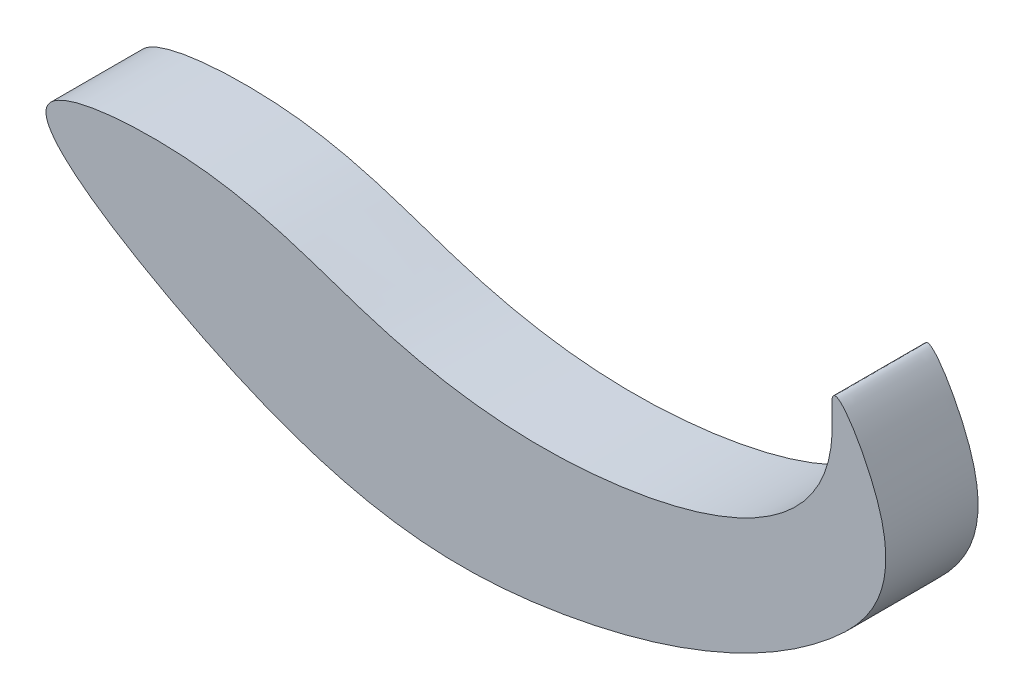
ISO-10303-21;
HEADER;
FILE_DESCRIPTION(('STEP AP214'),'2;1');
FILE_NAME('part.step','',(''),(''),'','','');
FILE_SCHEMA(('AUTOMOTIVE_DESIGN { 1 0 10303 214 1 1 1 1 }'));
ENDSEC;
DATA;
#1=APPLICATION_CONTEXT('core data for automotive mechanical design processes');
#2=APPLICATION_PROTOCOL_DEFINITION('international standard','automotive_design',2000,#1);
#3=PRODUCT_CONTEXT('',#1,'mechanical');
#4=PRODUCT('Part','Part','',(#3));
#5=PRODUCT_RELATED_PRODUCT_CATEGORY('part','',(#4));
#6=PRODUCT_DEFINITION_FORMATION('','',#4);
#7=PRODUCT_DEFINITION_CONTEXT('part definition',#1,'design');
#8=PRODUCT_DEFINITION('design','',#6,#7);
#9=PRODUCT_DEFINITION_SHAPE('','',#8);
#10=(LENGTH_UNIT() NAMED_UNIT(*) SI_UNIT(.MILLI.,.METRE.));
#11=(NAMED_UNIT(*) PLANE_ANGLE_UNIT() SI_UNIT($,.RADIAN.));
#12=(NAMED_UNIT(*) SI_UNIT($,.STERADIAN.) SOLID_ANGLE_UNIT());
#13=UNCERTAINTY_MEASURE_WITH_UNIT(LENGTH_MEASURE(1.E-05),#10,'distance_accuracy_value','');
#14=(GEOMETRIC_REPRESENTATION_CONTEXT(3) GLOBAL_UNCERTAINTY_ASSIGNED_CONTEXT((#13)) GLOBAL_UNIT_ASSIGNED_CONTEXT((#10,
#11,#12)) REPRESENTATION_CONTEXT('',''));
#15=CARTESIAN_POINT('',(0.,0.,0.));
#16=DIRECTION('',(0.,0.,1.));
#17=DIRECTION('',(1.,0.,0.));
#18=AXIS2_PLACEMENT_3D('',#15,#16,#17);
#19=CARTESIAN_POINT('',(46.9652053833255,-2.13577121476248,7.08325809197597));
#20=CARTESIAN_POINT('',(46.2961990722177,-3.35307462530558,7.08325809197596));
#21=CARTESIAN_POINT('',(57.710052242501,-10.5470922768467,7.08325809197596));
#22=CARTESIAN_POINT('',(68.2051634124732,-11.7407304976189,7.08325809197596));
#23=CARTESIAN_POINT('',(81.2113726092286,-7.46405077836386,7.08325809197596));
#24=CARTESIAN_POINT('',(86.248154765187,-1.03387053910356,7.08325809197596));
#25=CARTESIAN_POINT('',(82.1742571252595,5.45045749319543,7.08325809197596));
#26=CARTESIAN_POINT('',(82.8950574141747,-1.74696261097724,7.08325809197596));
#27=CARTESIAN_POINT('',(72.1031484819894,-5.23488763673371,7.08325809197596));
#28=CARTESIAN_POINT('',(61.8618016614909,-3.70617934272281,7.08325809197596));
#29=CARTESIAN_POINT('',(54.9571888055885,-0.547809740245359,7.08325809197596));
#30=CARTESIAN_POINT('',(47.4862394975476,-1.18771348537929,7.08325809197596));
#31=CARTESIAN_POINT('',(46.9652053833255,-2.13577121476248,7.08325809197597));
#32=B_SPLINE_CURVE_WITH_KNOTS('',3,(#19,#20,#21,#22,#23,#24,#25,#26,#27,#28,#29,#30,#31),
.UNSPECIFIED.,.T.,.F.,(4,1,1,1,1,1,1,1,1,1,4),(0.,0.0923147364100505,0.28472536279902,
0.438381343482038,0.513135631953603,0.555752133271628,0.567571824093398,0.711849537470118,
0.830635960109017,0.928103627549624,1.),.UNSPECIFIED.);
#33=DIRECTION('',(0.,0.,-1.));
#34=VECTOR('',#33,1.);
#35=SURFACE_OF_LINEAR_EXTRUSION('',#32,#34);
#36=CARTESIAN_POINT('',(46.9652053833255,-2.13577121476248,7.08325809197597));
#37=VERTEX_POINT('',#36);
#38=EDGE_CURVE('E10',#37,#37,#32,.T.);
#39=ORIENTED_EDGE('',*,*,#38,.F.);
#40=EDGE_LOOP('',(#39));
#41=FACE_BOUND('',#40,.T.);
#42=CARTESIAN_POINT('',(46.9652053833255,-2.13577121476248,2.91725809197596));
#43=CARTESIAN_POINT('',(46.2961990722177,-3.35307462530558,2.91725809197596));
#44=CARTESIAN_POINT('',(57.710052242501,-10.5470922768467,2.91725809197596));
#45=CARTESIAN_POINT('',(68.2051634124732,-11.7407304976189,2.91725809197596));
#46=CARTESIAN_POINT('',(81.2113726092286,-7.46405077836386,2.91725809197596));
#47=CARTESIAN_POINT('',(86.248154765187,-1.03387053910356,2.91725809197596));
#48=CARTESIAN_POINT('',(82.1742571252595,5.45045749319543,2.91725809197596));
#49=CARTESIAN_POINT('',(82.8950574141747,-1.74696261097724,2.91725809197596));
#50=CARTESIAN_POINT('',(72.1031484819894,-5.23488763673371,2.91725809197596));
#51=CARTESIAN_POINT('',(61.8618016614909,-3.70617934272281,2.91725809197596));
#52=CARTESIAN_POINT('',(54.9571888055885,-0.547809740245359,2.91725809197596));
#53=CARTESIAN_POINT('',(47.4862394975476,-1.18771348537929,2.91725809197596));
#54=CARTESIAN_POINT('',(46.9652053833255,-2.13577121476248,2.91725809197596));
#55=B_SPLINE_CURVE_WITH_KNOTS('',3,(#42,#43,#44,#45,#46,#47,#48,#49,#50,#51,#52,#53,#54),
.UNSPECIFIED.,.T.,.F.,(4,1,1,1,1,1,1,1,1,1,4),(0.,0.0923147364100505,0.28472536279902,
0.438381343482038,0.513135631953603,0.555752133271628,0.567571824093398,0.711849537470118,
0.830635960109017,0.928103627549624,1.),.UNSPECIFIED.);
#56=CARTESIAN_POINT('',(46.9652053833255,-2.13577121476248,2.91725809197596));
#57=VERTEX_POINT('',#56);
#58=EDGE_CURVE('E40',#57,#57,#55,.T.);
#59=ORIENTED_EDGE('',*,*,#58,.T.);
#60=EDGE_LOOP('',(#59));
#61=FACE_BOUND('',#60,.T.);
#62=ADVANCED_FACE('F36',(#41,#61),#35,.F.);
#63=CARTESIAN_POINT('',(84.7750330824676,-0.498797902974959,7.08325809197596));
#64=DIRECTION('',(0.,0.,1.));
#65=DIRECTION('',(1.,0.,0.));
#66=AXIS2_PLACEMENT_3D('',#63,#64,#65);
#67=PLANE('',#66);
#68=ORIENTED_EDGE('',*,*,#38,.T.);
#69=EDGE_LOOP('',(#68));
#70=FACE_BOUND('',#69,.T.);
#71=ADVANCED_FACE('F59',(#70),#67,.T.);
#72=CARTESIAN_POINT('',(84.7750330824676,-0.498797902974959,2.91725809197596));
#73=DIRECTION('',(0.,0.,1.));
#74=DIRECTION('',(1.,0.,0.));
#75=AXIS2_PLACEMENT_3D('',#72,#73,#74);
#76=PLANE('',#75);
#77=ORIENTED_EDGE('',*,*,#58,.F.);
#78=EDGE_LOOP('',(#77));
#79=FACE_BOUND('',#78,.T.);
#80=ADVANCED_FACE('F57',(#79),#76,.F.);
#81=CLOSED_SHELL('',(#62,#71,#80));
#82=MANIFOLD_SOLID_BREP('B2',#81);
#83=ADVANCED_BREP_SHAPE_REPRESENTATION('',(#18,#82),#14);
#84=SHAPE_DEFINITION_REPRESENTATION(#9,#83);
ENDSEC;
END-ISO-10303-21;
